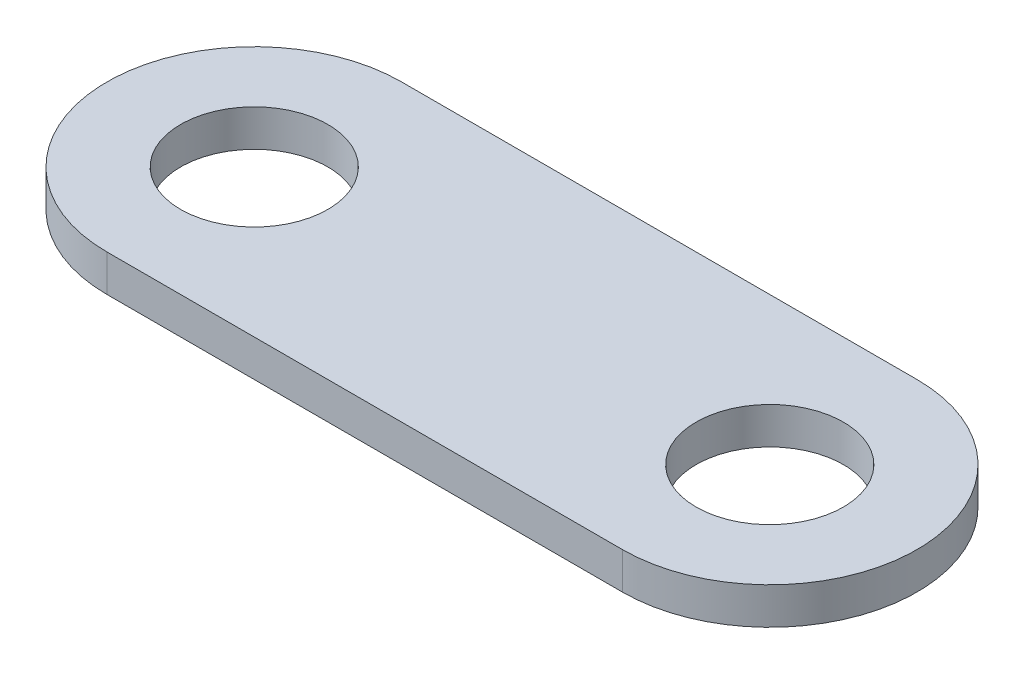
ISO-10303-21;
HEADER;
FILE_DESCRIPTION(('STEP AP214'),'2;1');
FILE_NAME('part.step','',(''),(''),'','','');
FILE_SCHEMA(('AUTOMOTIVE_DESIGN { 1 0 10303 214 1 1 1 1 }'));
ENDSEC;
DATA;
#1=APPLICATION_CONTEXT('core data for automotive mechanical design processes');
#2=APPLICATION_PROTOCOL_DEFINITION('international standard','automotive_design',2000,#1);
#3=PRODUCT_CONTEXT('',#1,'mechanical');
#4=PRODUCT('Part','Part','',(#3));
#5=PRODUCT_RELATED_PRODUCT_CATEGORY('part','',(#4));
#6=PRODUCT_DEFINITION_FORMATION('','',#4);
#7=PRODUCT_DEFINITION_CONTEXT('part definition',#1,'design');
#8=PRODUCT_DEFINITION('design','',#6,#7);
#9=PRODUCT_DEFINITION_SHAPE('','',#8);
#10=(LENGTH_UNIT() NAMED_UNIT(*) SI_UNIT(.MILLI.,.METRE.));
#11=(NAMED_UNIT(*) PLANE_ANGLE_UNIT() SI_UNIT($,.RADIAN.));
#12=(NAMED_UNIT(*) SI_UNIT($,.STERADIAN.) SOLID_ANGLE_UNIT());
#13=UNCERTAINTY_MEASURE_WITH_UNIT(LENGTH_MEASURE(1.E-05),#10,'distance_accuracy_value','');
#14=(GEOMETRIC_REPRESENTATION_CONTEXT(3) GLOBAL_UNCERTAINTY_ASSIGNED_CONTEXT((#13)) GLOBAL_UNIT_ASSIGNED_CONTEXT((#10,
#11,#12)) REPRESENTATION_CONTEXT('',''));
#15=CARTESIAN_POINT('',(0.,0.,0.));
#16=DIRECTION('',(0.,0.,1.));
#17=DIRECTION('',(1.,0.,0.));
#18=AXIS2_PLACEMENT_3D('',#15,#16,#17);
#19=CARTESIAN_POINT('',(0.,3.175,0.));
#20=DIRECTION('',(0.,1.,0.));
#21=DIRECTION('',(0.,0.,1.));
#22=AXIS2_PLACEMENT_3D('',#19,#20,#21);
#23=PLANE('',#22);
#24=CARTESIAN_POINT('',(0.,3.175,0.));
#25=DIRECTION('',(0.,1.,0.));
#26=DIRECTION('',(0.,0.,1.));
#27=AXIS2_PLACEMENT_3D('',#24,#25,#26);
#28=CIRCLE('',#27,6.35);
#29=CARTESIAN_POINT('',(0.,3.175,6.35));
#30=VERTEX_POINT('',#29);
#31=EDGE_CURVE('E102',#30,#30,#28,.T.);
#32=ORIENTED_EDGE('',*,*,#31,.F.);
#33=EDGE_LOOP('',(#32));
#34=FACE_BOUND('',#33,.T.);
#35=CARTESIAN_POINT('',(0.,3.175,0.));
#36=DIRECTION('',(0.,1.,0.));
#37=DIRECTION('',(0.,0.,1.));
#38=AXIS2_PLACEMENT_3D('',#35,#36,#37);
#39=CIRCLE('',#38,12.7);
#40=CARTESIAN_POINT('',(0.,3.175,-12.7));
#41=VERTEX_POINT('',#40);
#42=CARTESIAN_POINT('',(0.,3.175,12.7));
#43=VERTEX_POINT('',#42);
#44=EDGE_CURVE('E87',#41,#43,#39,.T.);
#45=ORIENTED_EDGE('',*,*,#44,.T.);
#46=DIRECTION('',(1.,0.,0.));
#47=VECTOR('',#46,1.);
#48=CARTESIAN_POINT('',(0.,3.175,12.7));
#49=LINE('',#48,#47);
#50=CARTESIAN_POINT('',(44.45,3.175,12.7));
#51=VERTEX_POINT('',#50);
#52=EDGE_CURVE('E82',#43,#51,#49,.T.);
#53=ORIENTED_EDGE('',*,*,#52,.T.);
#54=CARTESIAN_POINT('',(44.45,3.175,0.));
#55=DIRECTION('',(0.,1.,0.));
#56=DIRECTION('',(0.,0.,1.));
#57=AXIS2_PLACEMENT_3D('',#54,#55,#56);
#58=CIRCLE('',#57,12.7);
#59=CARTESIAN_POINT('',(44.45,3.175,-12.7));
#60=VERTEX_POINT('',#59);
#61=EDGE_CURVE('E85',#51,#60,#58,.T.);
#62=ORIENTED_EDGE('',*,*,#61,.T.);
#63=DIRECTION('',(-1.,0.,0.));
#64=VECTOR('',#63,1.);
#65=CARTESIAN_POINT('',(0.,3.175,-12.7));
#66=LINE('',#65,#64);
#67=EDGE_CURVE('E52',#60,#41,#66,.T.);
#68=ORIENTED_EDGE('',*,*,#67,.T.);
#69=EDGE_LOOP('',(#45,#53,#62,#68));
#70=FACE_BOUND('',#69,.T.);
#71=CARTESIAN_POINT('',(44.45,3.175,0.));
#72=DIRECTION('',(0.,1.,0.));
#73=DIRECTION('',(0.,0.,1.));
#74=AXIS2_PLACEMENT_3D('',#71,#72,#73);
#75=CIRCLE('',#74,6.35);
#76=CARTESIAN_POINT('',(44.45,3.175,6.35));
#77=VERTEX_POINT('',#76);
#78=EDGE_CURVE('E117',#77,#77,#75,.T.);
#79=ORIENTED_EDGE('',*,*,#78,.F.);
#80=EDGE_LOOP('',(#79));
#81=FACE_BOUND('',#80,.T.);
#82=ADVANCED_FACE('F35',(#34,#70,#81),#23,.T.);
#83=CARTESIAN_POINT('',(0.,0.,0.));
#84=DIRECTION('',(0.,1.,0.));
#85=DIRECTION('',(0.,0.,1.));
#86=AXIS2_PLACEMENT_3D('',#83,#84,#85);
#87=PLANE('',#86);
#88=CARTESIAN_POINT('',(0.,0.,0.));
#89=DIRECTION('',(0.,1.,0.));
#90=DIRECTION('',(0.,0.,1.));
#91=AXIS2_PLACEMENT_3D('',#88,#89,#90);
#92=CIRCLE('',#91,12.7);
#93=CARTESIAN_POINT('',(0.,0.,-12.7));
#94=VERTEX_POINT('',#93);
#95=CARTESIAN_POINT('',(0.,0.,12.7));
#96=VERTEX_POINT('',#95);
#97=EDGE_CURVE('E99',#94,#96,#92,.T.);
#98=ORIENTED_EDGE('',*,*,#97,.F.);
#99=DIRECTION('',(-1.,0.,0.));
#100=VECTOR('',#99,1.);
#101=CARTESIAN_POINT('',(0.,0.,-12.7));
#102=LINE('',#101,#100);
#103=CARTESIAN_POINT('',(44.45,0.,-12.7));
#104=VERTEX_POINT('',#103);
#105=EDGE_CURVE('E75',#104,#94,#102,.T.);
#106=ORIENTED_EDGE('',*,*,#105,.F.);
#107=CARTESIAN_POINT('',(44.45,0.,0.));
#108=DIRECTION('',(0.,1.,0.));
#109=DIRECTION('',(0.,0.,1.));
#110=AXIS2_PLACEMENT_3D('',#107,#108,#109);
#111=CIRCLE('',#110,12.7);
#112=CARTESIAN_POINT('',(44.45,0.,12.7));
#113=VERTEX_POINT('',#112);
#114=EDGE_CURVE('E69',#113,#104,#111,.T.);
#115=ORIENTED_EDGE('',*,*,#114,.F.);
#116=DIRECTION('',(1.,0.,0.));
#117=VECTOR('',#116,1.);
#118=CARTESIAN_POINT('',(0.,0.,12.7));
#119=LINE('',#118,#117);
#120=EDGE_CURVE('E91',#96,#113,#119,.T.);
#121=ORIENTED_EDGE('',*,*,#120,.F.);
#122=EDGE_LOOP('',(#98,#106,#115,#121));
#123=FACE_BOUND('',#122,.T.);
#124=CARTESIAN_POINT('',(0.,0.,0.));
#125=DIRECTION('',(0.,1.,0.));
#126=DIRECTION('',(0.,0.,1.));
#127=AXIS2_PLACEMENT_3D('',#124,#125,#126);
#128=CIRCLE('',#127,6.35);
#129=CARTESIAN_POINT('',(0.,0.,6.35));
#130=VERTEX_POINT('',#129);
#131=EDGE_CURVE('E114',#130,#130,#128,.T.);
#132=ORIENTED_EDGE('',*,*,#131,.T.);
#133=EDGE_LOOP('',(#132));
#134=FACE_BOUND('',#133,.T.);
#135=CARTESIAN_POINT('',(44.45,0.,0.));
#136=DIRECTION('',(0.,1.,0.));
#137=DIRECTION('',(0.,0.,1.));
#138=AXIS2_PLACEMENT_3D('',#135,#136,#137);
#139=CIRCLE('',#138,6.35);
#140=CARTESIAN_POINT('',(44.45,0.,6.35));
#141=VERTEX_POINT('',#140);
#142=EDGE_CURVE('E120',#141,#141,#139,.T.);
#143=ORIENTED_EDGE('',*,*,#142,.T.);
#144=EDGE_LOOP('',(#143));
#145=FACE_BOUND('',#144,.T.);
#146=ADVANCED_FACE('F110',(#123,#134,#145),#87,.F.);
#147=CARTESIAN_POINT('',(0.,3.175,0.));
#148=DIRECTION('',(0.,-1.,0.));
#149=DIRECTION('',(0.,0.,-1.));
#150=AXIS2_PLACEMENT_3D('',#147,#148,#149);
#151=CYLINDRICAL_SURFACE('',#150,12.7);
#152=ORIENTED_EDGE('',*,*,#97,.T.);
#153=DIRECTION('',(0.,-1.,0.));
#154=VECTOR('',#153,1.);
#155=CARTESIAN_POINT('',(0.,3.175,12.7));
#156=LINE('',#155,#154);
#157=EDGE_CURVE('E11',#43,#96,#156,.T.);
#158=ORIENTED_EDGE('',*,*,#157,.F.);
#159=ORIENTED_EDGE('',*,*,#44,.F.);
#160=DIRECTION('',(0.,-1.,0.));
#161=VECTOR('',#160,1.);
#162=CARTESIAN_POINT('',(0.,3.175,-12.7));
#163=LINE('',#162,#161);
#164=EDGE_CURVE('E95',#41,#94,#163,.T.);
#165=ORIENTED_EDGE('',*,*,#164,.T.);
#166=EDGE_LOOP('',(#152,#158,#159,#165));
#167=FACE_BOUND('',#166,.T.);
#168=ADVANCED_FACE('F37',(#167),#151,.T.);
#169=CARTESIAN_POINT('',(0.,3.175,12.7));
#170=DIRECTION('',(0.,0.,-1.));
#171=DIRECTION('',(-1.,0.,0.));
#172=AXIS2_PLACEMENT_3D('',#169,#170,#171);
#173=PLANE('',#172);
#174=ORIENTED_EDGE('',*,*,#120,.T.);
#175=DIRECTION('',(0.,-1.,0.));
#176=VECTOR('',#175,1.);
#177=CARTESIAN_POINT('',(44.45,3.175,12.7));
#178=LINE('',#177,#176);
#179=EDGE_CURVE('E44',#51,#113,#178,.T.);
#180=ORIENTED_EDGE('',*,*,#179,.F.);
#181=ORIENTED_EDGE('',*,*,#52,.F.);
#182=ORIENTED_EDGE('',*,*,#157,.T.);
#183=EDGE_LOOP('',(#174,#180,#181,#182));
#184=FACE_BOUND('',#183,.T.);
#185=ADVANCED_FACE('F90',(#184),#173,.F.);
#186=CARTESIAN_POINT('',(44.45,3.175,0.));
#187=DIRECTION('',(0.,-1.,0.));
#188=DIRECTION('',(0.,0.,-1.));
#189=AXIS2_PLACEMENT_3D('',#186,#187,#188);
#190=CYLINDRICAL_SURFACE('',#189,12.7);
#191=ORIENTED_EDGE('',*,*,#114,.T.);
#192=DIRECTION('',(0.,-1.,0.));
#193=VECTOR('',#192,1.);
#194=CARTESIAN_POINT('',(44.45,3.175,-12.7));
#195=LINE('',#194,#193);
#196=EDGE_CURVE('E92',#60,#104,#195,.T.);
#197=ORIENTED_EDGE('',*,*,#196,.F.);
#198=ORIENTED_EDGE('',*,*,#61,.F.);
#199=ORIENTED_EDGE('',*,*,#179,.T.);
#200=EDGE_LOOP('',(#191,#197,#198,#199));
#201=FACE_BOUND('',#200,.T.);
#202=ADVANCED_FACE('F93',(#201),#190,.T.);
#203=CARTESIAN_POINT('',(0.,3.175,-12.7));
#204=DIRECTION('',(0.,0.,1.));
#205=DIRECTION('',(1.,0.,0.));
#206=AXIS2_PLACEMENT_3D('',#203,#204,#205);
#207=PLANE('',#206);
#208=ORIENTED_EDGE('',*,*,#105,.T.);
#209=ORIENTED_EDGE('',*,*,#164,.F.);
#210=ORIENTED_EDGE('',*,*,#67,.F.);
#211=ORIENTED_EDGE('',*,*,#196,.T.);
#212=EDGE_LOOP('',(#208,#209,#210,#211));
#213=FACE_BOUND('',#212,.T.);
#214=ADVANCED_FACE('F107',(#213),#207,.F.);
#215=CARTESIAN_POINT('',(0.,3.175,0.));
#216=DIRECTION('',(0.,-1.,0.));
#217=DIRECTION('',(0.,0.,-1.));
#218=AXIS2_PLACEMENT_3D('',#215,#216,#217);
#219=CYLINDRICAL_SURFACE('',#218,6.35);
#220=ORIENTED_EDGE('',*,*,#31,.T.);
#221=EDGE_LOOP('',(#220));
#222=FACE_BOUND('',#221,.T.);
#223=ORIENTED_EDGE('',*,*,#131,.F.);
#224=EDGE_LOOP('',(#223));
#225=FACE_BOUND('',#224,.T.);
#226=ADVANCED_FACE('F137',(#222,#225),#219,.F.);
#227=CARTESIAN_POINT('',(44.45,3.175,0.));
#228=DIRECTION('',(0.,-1.,0.));
#229=DIRECTION('',(0.,0.,-1.));
#230=AXIS2_PLACEMENT_3D('',#227,#228,#229);
#231=CYLINDRICAL_SURFACE('',#230,6.35);
#232=ORIENTED_EDGE('',*,*,#78,.T.);
#233=EDGE_LOOP('',(#232));
#234=FACE_BOUND('',#233,.T.);
#235=ORIENTED_EDGE('',*,*,#142,.F.);
#236=EDGE_LOOP('',(#235));
#237=FACE_BOUND('',#236,.T.);
#238=ADVANCED_FACE('F126',(#234,#237),#231,.F.);
#239=CLOSED_SHELL('',(#82,#146,#168,#185,#202,#214,#226,#238));
#240=MANIFOLD_SOLID_BREP('B2',#239);
#241=ADVANCED_BREP_SHAPE_REPRESENTATION('',(#18,#240),#14);
#242=SHAPE_DEFINITION_REPRESENTATION(#9,#241);
ENDSEC;
END-ISO-10303-21;
